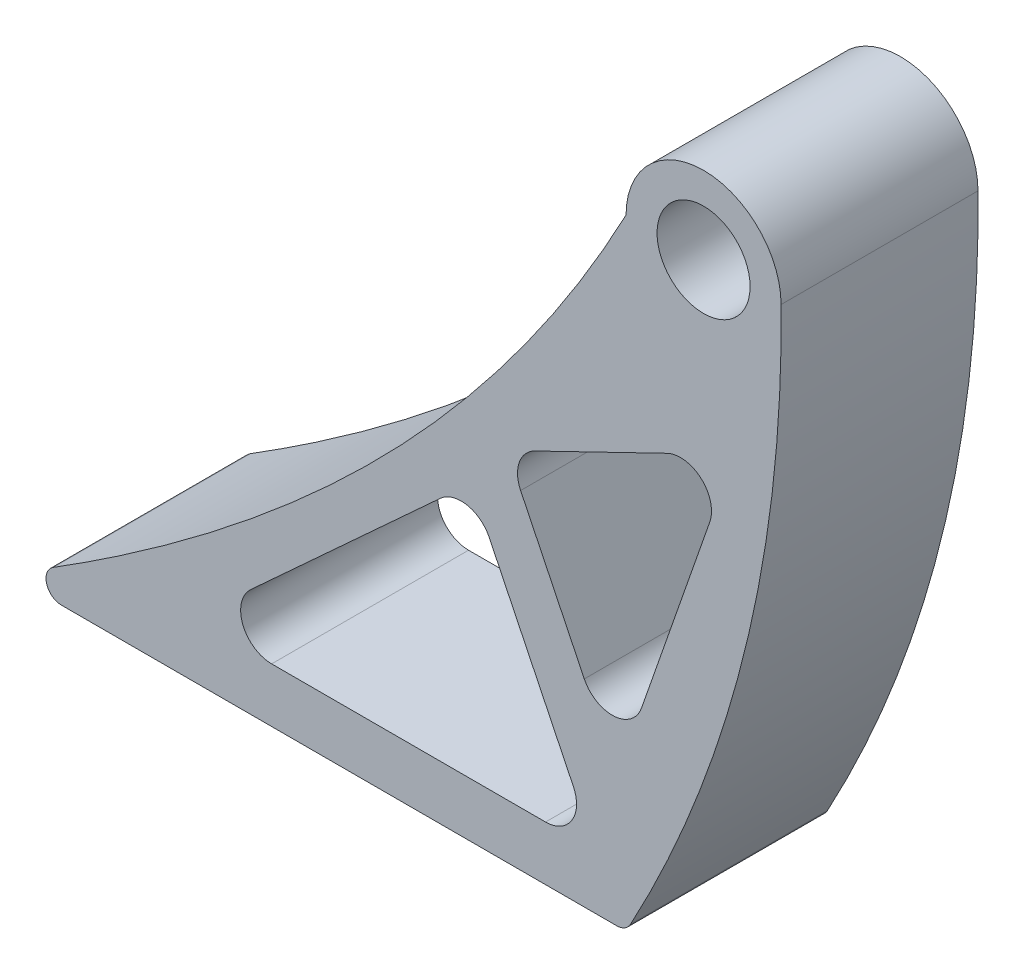
ISO-10303-21;
HEADER;
FILE_DESCRIPTION(('STEP AP214'),'2;1');
FILE_NAME('part.step','',(''),(''),'','','');
FILE_SCHEMA(('AUTOMOTIVE_DESIGN { 1 0 10303 214 1 1 1 1 }'));
ENDSEC;
DATA;
#1=APPLICATION_CONTEXT('core data for automotive mechanical design processes');
#2=APPLICATION_PROTOCOL_DEFINITION('international standard','automotive_design',2000,#1);
#3=PRODUCT_CONTEXT('',#1,'mechanical');
#4=PRODUCT('Part','Part','',(#3));
#5=PRODUCT_RELATED_PRODUCT_CATEGORY('part','',(#4));
#6=PRODUCT_DEFINITION_FORMATION('','',#4);
#7=PRODUCT_DEFINITION_CONTEXT('part definition',#1,'design');
#8=PRODUCT_DEFINITION('design','',#6,#7);
#9=PRODUCT_DEFINITION_SHAPE('','',#8);
#10=(LENGTH_UNIT() NAMED_UNIT(*) SI_UNIT(.MILLI.,.METRE.));
#11=(NAMED_UNIT(*) PLANE_ANGLE_UNIT() SI_UNIT($,.RADIAN.));
#12=(NAMED_UNIT(*) SI_UNIT($,.STERADIAN.) SOLID_ANGLE_UNIT());
#13=UNCERTAINTY_MEASURE_WITH_UNIT(LENGTH_MEASURE(1.E-05),#10,'distance_accuracy_value','');
#14=(GEOMETRIC_REPRESENTATION_CONTEXT(3) GLOBAL_UNCERTAINTY_ASSIGNED_CONTEXT((#13)) GLOBAL_UNIT_ASSIGNED_CONTEXT((#10,
#11,#12)) REPRESENTATION_CONTEXT('',''));
#15=CARTESIAN_POINT('',(0.,0.,0.));
#16=DIRECTION('',(0.,0.,1.));
#17=DIRECTION('',(1.,0.,0.));
#18=AXIS2_PLACEMENT_3D('',#15,#16,#17);
#19=CARTESIAN_POINT('',(39.4061587029717,1.,12.7));
#20=DIRECTION('',(0.,0.,1.));
#21=DIRECTION('',(1.,0.,0.));
#22=AXIS2_PLACEMENT_3D('',#19,#20,#21);
#23=PLANE('',#22);
#24=CARTESIAN_POINT('',(39.4061587029717,1.,12.7));
#25=DIRECTION('',(0.,0.,1.));
#26=DIRECTION('',(1.,0.,0.));
#27=AXIS2_PLACEMENT_3D('',#24,#25,#26);
#28=CIRCLE('',#27,1.);
#29=CARTESIAN_POINT('',(39.4061587029717,0.,12.7));
#30=VERTEX_POINT('',#29);
#31=CARTESIAN_POINT('',(40.2858714885197,0.524494568965308,12.7));
#32=VERTEX_POINT('',#31);
#33=EDGE_CURVE('E309',#30,#32,#28,.T.);
#34=ORIENTED_EDGE('',*,*,#33,.T.);
#35=CARTESIAN_POINT('',(40.2858714885197,0.524494568965308,12.7));
#36=CARTESIAN_POINT('',(46.9110134326086,12.7813936365593,12.7));
#37=CARTESIAN_POINT('',(50.1530450932038,25.9540132691208,12.7));
#38=CARTESIAN_POINT('',(50.0000000000477,40.,12.7));
#39=B_SPLINE_CURVE_WITH_KNOTS('',3,(#35,#36,#37,#38),.UNSPECIFIED.,.F.,.F.,(4,4),
(0.0140779081040227,1.),.UNSPECIFIED.);
#40=CARTESIAN_POINT('',(50.0000000000477,40.,12.7));
#41=VERTEX_POINT('',#40);
#42=EDGE_CURVE('E313',#32,#41,#39,.T.);
#43=ORIENTED_EDGE('',*,*,#42,.T.);
#44=CARTESIAN_POINT('',(45.,40.,12.7));
#45=DIRECTION('',(0.,0.,1.));
#46=DIRECTION('',(1.,0.,0.));
#47=AXIS2_PLACEMENT_3D('',#44,#45,#46);
#48=CIRCLE('',#47,5.00000000004766);
#49=CARTESIAN_POINT('',(39.9999999999523,40.,12.7));
#50=VERTEX_POINT('',#49);
#51=EDGE_CURVE('E320',#41,#50,#48,.T.);
#52=ORIENTED_EDGE('',*,*,#51,.T.);
#53=CARTESIAN_POINT('',(39.9999999999523,40.,12.7));
#54=CARTESIAN_POINT('',(31.5004996661518,23.9376744051401,12.7));
#55=CARTESIAN_POINT('',(18.6584809453997,11.5960321004043,12.7));
#56=CARTESIAN_POINT('',(3.05783486665256,1.84805765172679,12.7));
#57=B_SPLINE_CURVE_WITH_KNOTS('',3,(#53,#54,#55,#56),.UNSPECIFIED.,.F.,.F.,(4,4),
(0.0605567772307313,1.),.UNSPECIFIED.);
#58=CARTESIAN_POINT('',(3.05783486665256,1.84805765172679,12.7));
#59=VERTEX_POINT('',#58);
#60=EDGE_CURVE('E339',#50,#59,#57,.T.);
#61=ORIENTED_EDGE('',*,*,#60,.T.);
#62=CARTESIAN_POINT('',(3.58773883846976,1.,12.7));
#63=DIRECTION('',(0.,0.,1.));
#64=DIRECTION('',(-1.,0.,0.));
#65=AXIS2_PLACEMENT_3D('',#62,#63,#64);
#66=CIRCLE('',#65,1.);
#67=CARTESIAN_POINT('',(3.58773883846976,0.,12.7));
#68=VERTEX_POINT('',#67);
#69=EDGE_CURVE('E345',#59,#68,#66,.T.);
#70=ORIENTED_EDGE('',*,*,#69,.T.);
#71=DIRECTION('',(1.,0.,0.));
#72=VECTOR('',#71,1.);
#73=CARTESIAN_POINT('',(3.58773883846976,0.,12.7));
#74=LINE('',#73,#72);
#75=EDGE_CURVE('E351',#68,#30,#74,.T.);
#76=ORIENTED_EDGE('',*,*,#75,.T.);
#77=EDGE_LOOP('',(#34,#43,#52,#61,#70,#76));
#78=FACE_BOUND('',#77,.T.);
#79=CARTESIAN_POINT('',(45.,40.,12.7));
#80=DIRECTION('',(0.,0.,1.));
#81=DIRECTION('',(1.,0.,0.));
#82=AXIS2_PLACEMENT_3D('',#79,#80,#81);
#83=CIRCLE('',#82,3.);
#84=CARTESIAN_POINT('',(48.,40.,12.7));
#85=VERTEX_POINT('',#84);
#86=EDGE_CURVE('E301',#85,#85,#83,.T.);
#87=ORIENTED_EDGE('',*,*,#86,.F.);
#88=EDGE_LOOP('',(#87));
#89=FACE_BOUND('',#88,.T.);
#90=DIRECTION('',(-0.8998141071962,-0.436273506519369,0.));
#91=VECTOR('',#90,1.);
#92=CARTESIAN_POINT('',(34.1274479992558,23.8845854131092,12.7));
#93=LINE('',#92,#91);
#94=CARTESIAN_POINT('',(42.6399210906285,28.0118450937747,12.7));
#95=VERTEX_POINT('',#94);
#96=CARTESIAN_POINT('',(34.1274479992558,23.8845854131092,12.7));
#97=VERTEX_POINT('',#96);
#98=EDGE_CURVE('E241',#95,#97,#93,.T.);
#99=ORIENTED_EDGE('',*,*,#98,.F.);
#100=CARTESIAN_POINT('',(43.5124681036673,26.2122168793824,12.7));
#101=DIRECTION('',(0.,0.,1.));
#102=DIRECTION('',(-1.,0.,0.));
#103=AXIS2_PLACEMENT_3D('',#100,#101,#102);
#104=CIRCLE('',#103,2.);
#105=CARTESIAN_POINT('',(45.4003381871143,25.5519543951948,12.7));
#106=VERTEX_POINT('',#105);
#107=EDGE_CURVE('E238',#106,#95,#104,.T.);
#108=ORIENTED_EDGE('',*,*,#107,.F.);
#109=DIRECTION('',(0.330131242093745,0.943935041723551,0.));
#110=VECTOR('',#109,1.);
#111=CARTESIAN_POINT('',(45.4003381871143,25.5519543951948,12.7));
#112=LINE('',#111,#110);
#113=CARTESIAN_POINT('',(40.994560125963,12.9546362146978,12.7));
#114=VERTEX_POINT('',#113);
#115=EDGE_CURVE('E255',#114,#106,#112,.T.);
#116=ORIENTED_EDGE('',*,*,#115,.F.);
#117=CARTESIAN_POINT('',(39.1066900425159,13.6148986988852,12.7));
#118=DIRECTION('',(0.,0.,1.));
#119=DIRECTION('',(-1.,0.,0.));
#120=AXIS2_PLACEMENT_3D('',#117,#118,#119);
#121=CIRCLE('',#120,2.);
#122=CARTESIAN_POINT('',(37.3070618281234,12.7423516858465,12.7));
#123=VERTEX_POINT('',#122);
#124=EDGE_CURVE('E251',#123,#114,#121,.T.);
#125=ORIENTED_EDGE('',*,*,#124,.F.);
#126=DIRECTION('',(0.436273506519369,-0.8998141071962,0.));
#127=VECTOR('',#126,1.);
#128=CARTESIAN_POINT('',(37.3070618281234,12.7423516858465,12.7));
#129=LINE('',#128,#127);
#130=CARTESIAN_POINT('',(33.2003667979021,21.212410185678,12.7));
#131=VERTEX_POINT('',#130);
#132=EDGE_CURVE('E248',#131,#123,#129,.T.);
#133=ORIENTED_EDGE('',*,*,#132,.F.);
#134=CARTESIAN_POINT('',(34.9999950122945,22.0849571987168,12.7));
#135=DIRECTION('',(0.,0.,1.));
#136=DIRECTION('',(-1.,0.,0.));
#137=AXIS2_PLACEMENT_3D('',#134,#135,#136);
#138=CIRCLE('',#137,2.);
#139=EDGE_CURVE('E245',#97,#131,#138,.T.);
#140=ORIENTED_EDGE('',*,*,#139,.F.);
#141=EDGE_LOOP('',(#99,#108,#116,#125,#133,#140));
#142=FACE_BOUND('',#141,.T.);
#143=DIRECTION('',(-0.737154140200741,-0.675724628517346,0.));
#144=VECTOR('',#143,1.);
#145=CARTESIAN_POINT('',(15.7901544877107,6.97430828040152,12.7));
#146=LINE('',#145,#144);
#147=CARTESIAN_POINT('',(28.0204746235114,18.1854350715521,12.7));
#148=VERTEX_POINT('',#147);
#149=CARTESIAN_POINT('',(15.7901544877107,6.97430828040152,12.7));
#150=VERTEX_POINT('',#149);
#151=EDGE_CURVE('E178',#148,#150,#146,.T.);
#152=ORIENTED_EDGE('',*,*,#151,.F.);
#153=CARTESIAN_POINT('',(29.3719238805461,16.7111267911506,12.7));
#154=DIRECTION('',(0.,0.,1.));
#155=DIRECTION('',(-1.,0.,0.));
#156=AXIS2_PLACEMENT_3D('',#153,#154,#155);
#157=CIRCLE('',#156,2.);
#158=CARTESIAN_POINT('',(31.1715520949385,17.5836738041894,12.7));
#159=VERTEX_POINT('',#158);
#160=EDGE_CURVE('E169',#159,#148,#157,.T.);
#161=ORIENTED_EDGE('',*,*,#160,.F.);
#162=DIRECTION('',(-0.436273506519369,0.899814107196199,0.));
#163=VECTOR('',#162,1.);
#164=CARTESIAN_POINT('',(31.1715520949385,17.5836738041894,12.7));
#165=LINE('',#164,#163);
#166=CARTESIAN_POINT('',(36.6072499330721,6.37254701303876,12.7));
#167=VERTEX_POINT('',#166);
#168=EDGE_CURVE('E204',#167,#159,#165,.T.);
#169=ORIENTED_EDGE('',*,*,#168,.F.);
#170=CARTESIAN_POINT('',(34.8076217186797,5.5,12.7));
#171=DIRECTION('',(0.,0.,1.));
#172=DIRECTION('',(-1.,0.,0.));
#173=AXIS2_PLACEMENT_3D('',#170,#171,#172);
#174=CIRCLE('',#173,2.);
#175=CARTESIAN_POINT('',(34.8076217186797,3.5,12.7));
#176=VERTEX_POINT('',#175);
#177=EDGE_CURVE('E201',#176,#167,#174,.T.);
#178=ORIENTED_EDGE('',*,*,#177,.F.);
#179=DIRECTION('',(1.,0.,0.));
#180=VECTOR('',#179,1.);
#181=CARTESIAN_POINT('',(34.8076217186797,3.5,12.7));
#182=LINE('',#181,#180);
#183=CARTESIAN_POINT('',(17.1416037447455,3.5,12.7));
#184=VERTEX_POINT('',#183);
#185=EDGE_CURVE('E196',#184,#176,#182,.T.);
#186=ORIENTED_EDGE('',*,*,#185,.F.);
#187=CARTESIAN_POINT('',(17.1416037447454,5.5,12.7));
#188=DIRECTION('',(0.,0.,1.));
#189=DIRECTION('',(1.,0.,0.));
#190=AXIS2_PLACEMENT_3D('',#187,#188,#189);
#191=CIRCLE('',#190,2.);
#192=EDGE_CURVE('E192',#150,#184,#191,.T.);
#193=ORIENTED_EDGE('',*,*,#192,.F.);
#194=EDGE_LOOP('',(#152,#161,#169,#178,#186,#193));
#195=FACE_BOUND('',#194,.T.);
#196=ADVANCED_FACE('F43',(#78,#89,#142,#195),#23,.T.);
#197=CARTESIAN_POINT('',(39.4061587029717,1.,0.));
#198=DIRECTION('',(0.,0.,1.));
#199=DIRECTION('',(1.,0.,0.));
#200=AXIS2_PLACEMENT_3D('',#197,#198,#199);
#201=PLANE('',#200);
#202=CARTESIAN_POINT('',(43.5124681036673,26.2122168793824,0.));
#203=DIRECTION('',(0.,0.,1.));
#204=DIRECTION('',(-1.,0.,0.));
#205=AXIS2_PLACEMENT_3D('',#202,#203,#204);
#206=CIRCLE('',#205,2.);
#207=CARTESIAN_POINT('',(45.4003381871143,25.5519543951948,0.));
#208=VERTEX_POINT('',#207);
#209=CARTESIAN_POINT('',(42.6399210906285,28.0118450937747,0.));
#210=VERTEX_POINT('',#209);
#211=EDGE_CURVE('E187',#208,#210,#206,.T.);
#212=ORIENTED_EDGE('',*,*,#211,.T.);
#213=DIRECTION('',(-0.8998141071962,-0.436273506519369,0.));
#214=VECTOR('',#213,1.);
#215=CARTESIAN_POINT('',(34.1274479992558,23.8845854131092,0.));
#216=LINE('',#215,#214);
#217=CARTESIAN_POINT('',(34.1274479992558,23.8845854131092,0.));
#218=VERTEX_POINT('',#217);
#219=EDGE_CURVE('E262',#210,#218,#216,.T.);
#220=ORIENTED_EDGE('',*,*,#219,.T.);
#221=CARTESIAN_POINT('',(34.9999950122945,22.0849571987168,0.));
#222=DIRECTION('',(0.,0.,1.));
#223=DIRECTION('',(-1.,0.,0.));
#224=AXIS2_PLACEMENT_3D('',#221,#222,#223);
#225=CIRCLE('',#224,2.);
#226=CARTESIAN_POINT('',(33.2003667979021,21.212410185678,0.));
#227=VERTEX_POINT('',#226);
#228=EDGE_CURVE('E266',#218,#227,#225,.T.);
#229=ORIENTED_EDGE('',*,*,#228,.T.);
#230=DIRECTION('',(0.436273506519369,-0.8998141071962,0.));
#231=VECTOR('',#230,1.);
#232=CARTESIAN_POINT('',(37.3070618281234,12.7423516858465,0.));
#233=LINE('',#232,#231);
#234=CARTESIAN_POINT('',(37.3070618281234,12.7423516858465,0.));
#235=VERTEX_POINT('',#234);
#236=EDGE_CURVE('E270',#227,#235,#233,.T.);
#237=ORIENTED_EDGE('',*,*,#236,.T.);
#238=CARTESIAN_POINT('',(39.1066900425159,13.6148986988852,0.));
#239=DIRECTION('',(0.,0.,1.));
#240=DIRECTION('',(-1.,0.,0.));
#241=AXIS2_PLACEMENT_3D('',#238,#239,#240);
#242=CIRCLE('',#241,2.);
#243=CARTESIAN_POINT('',(40.994560125963,12.9546362146978,0.));
#244=VERTEX_POINT('',#243);
#245=EDGE_CURVE('E274',#235,#244,#242,.T.);
#246=ORIENTED_EDGE('',*,*,#245,.T.);
#247=DIRECTION('',(0.330131242093745,0.943935041723551,0.));
#248=VECTOR('',#247,1.);
#249=CARTESIAN_POINT('',(45.4003381871143,25.5519543951948,0.));
#250=LINE('',#249,#248);
#251=EDGE_CURVE('E242',#244,#208,#250,.T.);
#252=ORIENTED_EDGE('',*,*,#251,.T.);
#253=EDGE_LOOP('',(#212,#220,#229,#237,#246,#252));
#254=FACE_BOUND('',#253,.T.);
#255=CARTESIAN_POINT('',(39.4061587029717,1.,0.));
#256=DIRECTION('',(0.,0.,1.));
#257=DIRECTION('',(1.,0.,0.));
#258=AXIS2_PLACEMENT_3D('',#255,#256,#257);
#259=CIRCLE('',#258,1.);
#260=CARTESIAN_POINT('',(39.4061587029717,0.,0.));
#261=VERTEX_POINT('',#260);
#262=CARTESIAN_POINT('',(40.2858714885197,0.524494568965308,0.));
#263=VERTEX_POINT('',#262);
#264=EDGE_CURVE('E305',#261,#263,#259,.T.);
#265=ORIENTED_EDGE('',*,*,#264,.F.);
#266=DIRECTION('',(1.,0.,0.));
#267=VECTOR('',#266,1.);
#268=CARTESIAN_POINT('',(3.58773883846976,0.,0.));
#269=LINE('',#268,#267);
#270=CARTESIAN_POINT('',(3.58773883846976,0.,0.));
#271=VERTEX_POINT('',#270);
#272=EDGE_CURVE('E314',#271,#261,#269,.T.);
#273=ORIENTED_EDGE('',*,*,#272,.F.);
#274=CARTESIAN_POINT('',(3.58773883846976,1.,0.));
#275=DIRECTION('',(0.,0.,1.));
#276=DIRECTION('',(-1.,0.,0.));
#277=AXIS2_PLACEMENT_3D('',#274,#275,#276);
#278=CIRCLE('',#277,1.);
#279=CARTESIAN_POINT('',(3.05783486665256,1.84805765172679,0.));
#280=VERTEX_POINT('',#279);
#281=EDGE_CURVE('E374',#280,#271,#278,.T.);
#282=ORIENTED_EDGE('',*,*,#281,.F.);
#283=CARTESIAN_POINT('',(39.9999999999523,40.,0.));
#284=CARTESIAN_POINT('',(31.5004996661518,23.9376744051401,0.));
#285=CARTESIAN_POINT('',(18.6584809453997,11.5960321004043,0.));
#286=CARTESIAN_POINT('',(3.05783486665256,1.84805765172679,0.));
#287=B_SPLINE_CURVE_WITH_KNOTS('',3,(#283,#284,#285,#286),.UNSPECIFIED.,.F.,.F.,(4,4),
(0.0605567772307313,1.),.UNSPECIFIED.);
#288=CARTESIAN_POINT('',(39.9999999999523,40.,0.));
#289=VERTEX_POINT('',#288);
#290=EDGE_CURVE('E369',#289,#280,#287,.T.);
#291=ORIENTED_EDGE('',*,*,#290,.F.);
#292=CARTESIAN_POINT('',(45.,40.,0.));
#293=DIRECTION('',(0.,0.,1.));
#294=DIRECTION('',(1.,0.,0.));
#295=AXIS2_PLACEMENT_3D('',#292,#293,#294);
#296=CIRCLE('',#295,5.00000000004766);
#297=CARTESIAN_POINT('',(50.0000000000477,40.,0.));
#298=VERTEX_POINT('',#297);
#299=EDGE_CURVE('E363',#298,#289,#296,.T.);
#300=ORIENTED_EDGE('',*,*,#299,.F.);
#301=CARTESIAN_POINT('',(40.2858714885197,0.524494568965308,0.));
#302=CARTESIAN_POINT('',(46.9110134326086,12.7813936365593,0.));
#303=CARTESIAN_POINT('',(50.1530450932038,25.9540132691208,0.));
#304=CARTESIAN_POINT('',(50.0000000000477,40.,0.));
#305=B_SPLINE_CURVE_WITH_KNOTS('',3,(#301,#302,#303,#304),.UNSPECIFIED.,.F.,.F.,(4,4),
(0.0140779081040227,1.),.UNSPECIFIED.);
#306=EDGE_CURVE('E358',#263,#298,#305,.T.);
#307=ORIENTED_EDGE('',*,*,#306,.F.);
#308=EDGE_LOOP('',(#265,#273,#282,#291,#300,#307));
#309=FACE_BOUND('',#308,.T.);
#310=CARTESIAN_POINT('',(45.,40.,0.));
#311=DIRECTION('',(0.,0.,1.));
#312=DIRECTION('',(1.,0.,0.));
#313=AXIS2_PLACEMENT_3D('',#310,#311,#312);
#314=CIRCLE('',#313,3.);
#315=CARTESIAN_POINT('',(48.,40.,0.));
#316=VERTEX_POINT('',#315);
#317=EDGE_CURVE('E300',#316,#316,#314,.T.);
#318=ORIENTED_EDGE('',*,*,#317,.T.);
#319=EDGE_LOOP('',(#318));
#320=FACE_BOUND('',#319,.T.);
#321=CARTESIAN_POINT('',(29.3719238805461,16.7111267911506,0.));
#322=DIRECTION('',(0.,0.,1.));
#323=DIRECTION('',(-1.,0.,0.));
#324=AXIS2_PLACEMENT_3D('',#321,#322,#323);
#325=CIRCLE('',#324,2.);
#326=CARTESIAN_POINT('',(31.1715520949385,17.5836738041894,0.));
#327=VERTEX_POINT('',#326);
#328=CARTESIAN_POINT('',(28.0204746235114,18.1854350715521,0.));
#329=VERTEX_POINT('',#328);
#330=EDGE_CURVE('E67',#327,#329,#325,.T.);
#331=ORIENTED_EDGE('',*,*,#330,.T.);
#332=DIRECTION('',(-0.737154140200741,-0.675724628517346,0.));
#333=VECTOR('',#332,1.);
#334=CARTESIAN_POINT('',(15.7901544877107,6.97430828040152,0.));
#335=LINE('',#334,#333);
#336=CARTESIAN_POINT('',(15.7901544877107,6.97430828040152,0.));
#337=VERTEX_POINT('',#336);
#338=EDGE_CURVE('E185',#329,#337,#335,.T.);
#339=ORIENTED_EDGE('',*,*,#338,.T.);
#340=CARTESIAN_POINT('',(17.1416037447454,5.5,0.));
#341=DIRECTION('',(0.,0.,1.));
#342=DIRECTION('',(1.,0.,0.));
#343=AXIS2_PLACEMENT_3D('',#340,#341,#342);
#344=CIRCLE('',#343,2.);
#345=CARTESIAN_POINT('',(17.1416037447455,3.5,0.));
#346=VERTEX_POINT('',#345);
#347=EDGE_CURVE('E211',#337,#346,#344,.T.);
#348=ORIENTED_EDGE('',*,*,#347,.T.);
#349=DIRECTION('',(1.,0.,0.));
#350=VECTOR('',#349,1.);
#351=CARTESIAN_POINT('',(34.8076217186797,3.5,0.));
#352=LINE('',#351,#350);
#353=CARTESIAN_POINT('',(34.8076217186797,3.5,0.));
#354=VERTEX_POINT('',#353);
#355=EDGE_CURVE('E215',#346,#354,#352,.T.);
#356=ORIENTED_EDGE('',*,*,#355,.T.);
#357=CARTESIAN_POINT('',(34.8076217186797,5.5,0.));
#358=DIRECTION('',(0.,0.,1.));
#359=DIRECTION('',(-1.,0.,0.));
#360=AXIS2_PLACEMENT_3D('',#357,#358,#359);
#361=CIRCLE('',#360,2.);
#362=CARTESIAN_POINT('',(36.6072499330721,6.37254701303876,0.));
#363=VERTEX_POINT('',#362);
#364=EDGE_CURVE('E219',#354,#363,#361,.T.);
#365=ORIENTED_EDGE('',*,*,#364,.T.);
#366=DIRECTION('',(-0.436273506519369,0.899814107196199,0.));
#367=VECTOR('',#366,1.);
#368=CARTESIAN_POINT('',(31.1715520949385,17.5836738041894,0.));
#369=LINE('',#368,#367);
#370=EDGE_CURVE('E179',#363,#327,#369,.T.);
#371=ORIENTED_EDGE('',*,*,#370,.T.);
#372=EDGE_LOOP('',(#331,#339,#348,#356,#365,#371));
#373=FACE_BOUND('',#372,.T.);
#374=ADVANCED_FACE('F405',(#254,#309,#320,#373),#201,.F.);
#375=CARTESIAN_POINT('',(39.4061587029717,1.,12.7));
#376=DIRECTION('',(0.,0.,-1.));
#377=DIRECTION('',(-1.,0.,0.));
#378=AXIS2_PLACEMENT_3D('',#375,#376,#377);
#379=CYLINDRICAL_SURFACE('',#378,1.);
#380=ORIENTED_EDGE('',*,*,#264,.T.);
#381=DIRECTION('',(0.,0.,-1.));
#382=VECTOR('',#381,1.);
#383=CARTESIAN_POINT('',(40.2858714885197,0.524494568965308,12.7));
#384=LINE('',#383,#382);
#385=EDGE_CURVE('E11',#32,#263,#384,.T.);
#386=ORIENTED_EDGE('',*,*,#385,.F.);
#387=ORIENTED_EDGE('',*,*,#33,.F.);
#388=DIRECTION('',(0.,0.,-1.));
#389=VECTOR('',#388,1.);
#390=CARTESIAN_POINT('',(39.4061587029717,0.,12.7));
#391=LINE('',#390,#389);
#392=EDGE_CURVE('E354',#30,#261,#391,.T.);
#393=ORIENTED_EDGE('',*,*,#392,.T.);
#394=EDGE_LOOP('',(#380,#386,#387,#393));
#395=FACE_BOUND('',#394,.T.);
#396=ADVANCED_FACE('F45',(#395),#379,.T.);
#397=DIRECTION('',(0.,0.,-1.));
#398=VECTOR('',#397,1.);
#399=SURFACE_OF_LINEAR_EXTRUSION('',#39,#398);
#400=ORIENTED_EDGE('',*,*,#306,.T.);
#401=DIRECTION('',(0.,0.,-1.));
#402=VECTOR('',#401,1.);
#403=CARTESIAN_POINT('',(50.0000000000477,40.,12.7));
#404=LINE('',#403,#402);
#405=EDGE_CURVE('E52',#41,#298,#404,.T.);
#406=ORIENTED_EDGE('',*,*,#405,.F.);
#407=ORIENTED_EDGE('',*,*,#42,.F.);
#408=ORIENTED_EDGE('',*,*,#385,.T.);
#409=EDGE_LOOP('',(#400,#406,#407,#408));
#410=FACE_BOUND('',#409,.T.);
#411=ADVANCED_FACE('F325',(#410),#399,.F.);
#412=CARTESIAN_POINT('',(45.,40.,12.7));
#413=DIRECTION('',(0.,0.,-1.));
#414=DIRECTION('',(-1.,0.,0.));
#415=AXIS2_PLACEMENT_3D('',#412,#413,#414);
#416=CYLINDRICAL_SURFACE('',#415,5.00000000004766);
#417=ORIENTED_EDGE('',*,*,#299,.T.);
#418=DIRECTION('',(0.,0.,-1.));
#419=VECTOR('',#418,1.);
#420=CARTESIAN_POINT('',(39.9999999999523,40.,12.7));
#421=LINE('',#420,#419);
#422=EDGE_CURVE('E393',#50,#289,#421,.T.);
#423=ORIENTED_EDGE('',*,*,#422,.F.);
#424=ORIENTED_EDGE('',*,*,#51,.F.);
#425=ORIENTED_EDGE('',*,*,#405,.T.);
#426=EDGE_LOOP('',(#417,#423,#424,#425));
#427=FACE_BOUND('',#426,.T.);
#428=ADVANCED_FACE('F328',(#427),#416,.T.);
#429=DIRECTION('',(0.,0.,-1.));
#430=VECTOR('',#429,1.);
#431=SURFACE_OF_LINEAR_EXTRUSION('',#57,#430);
#432=ORIENTED_EDGE('',*,*,#290,.T.);
#433=DIRECTION('',(0.,0.,-1.));
#434=VECTOR('',#433,1.);
#435=CARTESIAN_POINT('',(3.05783486665256,1.84805765172679,12.7));
#436=LINE('',#435,#434);
#437=EDGE_CURVE('E389',#59,#280,#436,.T.);
#438=ORIENTED_EDGE('',*,*,#437,.F.);
#439=ORIENTED_EDGE('',*,*,#60,.F.);
#440=ORIENTED_EDGE('',*,*,#422,.T.);
#441=EDGE_LOOP('',(#432,#438,#439,#440));
#442=FACE_BOUND('',#441,.T.);
#443=ADVANCED_FACE('F332',(#442),#431,.F.);
#444=CARTESIAN_POINT('',(3.58773883846976,1.,12.7));
#445=DIRECTION('',(0.,0.,-1.));
#446=DIRECTION('',(-1.,0.,0.));
#447=AXIS2_PLACEMENT_3D('',#444,#445,#446);
#448=CYLINDRICAL_SURFACE('',#447,1.);
#449=ORIENTED_EDGE('',*,*,#281,.T.);
#450=DIRECTION('',(0.,0.,-1.));
#451=VECTOR('',#450,1.);
#452=CARTESIAN_POINT('',(3.58773883846976,0.,12.7));
#453=LINE('',#452,#451);
#454=EDGE_CURVE('E385',#68,#271,#453,.T.);
#455=ORIENTED_EDGE('',*,*,#454,.F.);
#456=ORIENTED_EDGE('',*,*,#69,.F.);
#457=ORIENTED_EDGE('',*,*,#437,.T.);
#458=EDGE_LOOP('',(#449,#455,#456,#457));
#459=FACE_BOUND('',#458,.T.);
#460=ADVANCED_FACE('F336',(#459),#448,.T.);
#461=CARTESIAN_POINT('',(3.58773883846976,0.,12.7));
#462=DIRECTION('',(0.,1.,0.));
#463=DIRECTION('',(0.,0.,1.));
#464=AXIS2_PLACEMENT_3D('',#461,#462,#463);
#465=PLANE('',#464);
#466=ORIENTED_EDGE('',*,*,#272,.T.);
#467=ORIENTED_EDGE('',*,*,#392,.F.);
#468=ORIENTED_EDGE('',*,*,#75,.F.);
#469=ORIENTED_EDGE('',*,*,#454,.T.);
#470=EDGE_LOOP('',(#466,#467,#468,#469));
#471=FACE_BOUND('',#470,.T.);
#472=ADVANCED_FACE('F423',(#471),#465,.F.);
#473=CARTESIAN_POINT('',(45.,40.,12.7));
#474=DIRECTION('',(0.,0.,-1.));
#475=DIRECTION('',(-1.,0.,0.));
#476=AXIS2_PLACEMENT_3D('',#473,#474,#475);
#477=CYLINDRICAL_SURFACE('',#476,3.);
#478=ORIENTED_EDGE('',*,*,#86,.T.);
#479=EDGE_LOOP('',(#478));
#480=FACE_BOUND('',#479,.T.);
#481=ORIENTED_EDGE('',*,*,#317,.F.);
#482=EDGE_LOOP('',(#481));
#483=FACE_BOUND('',#482,.T.);
#484=ADVANCED_FACE('F425',(#480,#483),#477,.F.);
#485=CARTESIAN_POINT('',(43.5124681036673,26.2122168793824,12.7));
#486=DIRECTION('',(0.,0.,-1.));
#487=DIRECTION('',(-1.,0.,0.));
#488=AXIS2_PLACEMENT_3D('',#485,#486,#487);
#489=CYLINDRICAL_SURFACE('',#488,2.);
#490=ORIENTED_EDGE('',*,*,#211,.F.);
#491=DIRECTION('',(0.,0.,-1.));
#492=VECTOR('',#491,1.);
#493=CARTESIAN_POINT('',(45.4003381871143,25.5519543951948,12.7));
#494=LINE('',#493,#492);
#495=EDGE_CURVE('E258',#106,#208,#494,.T.);
#496=ORIENTED_EDGE('',*,*,#495,.F.);
#497=ORIENTED_EDGE('',*,*,#107,.T.);
#498=DIRECTION('',(0.,0.,-1.));
#499=VECTOR('',#498,1.);
#500=CARTESIAN_POINT('',(42.6399210906285,28.0118450937747,12.7));
#501=LINE('',#500,#499);
#502=EDGE_CURVE('E296',#95,#210,#501,.T.);
#503=ORIENTED_EDGE('',*,*,#502,.T.);
#504=EDGE_LOOP('',(#490,#496,#497,#503));
#505=FACE_BOUND('',#504,.T.);
#506=ADVANCED_FACE('F430',(#505),#489,.F.);
#507=CARTESIAN_POINT('',(34.1274479992558,23.8845854131092,12.7));
#508=DIRECTION('',(0.436273506519369,-0.8998141071962,0.));
#509=DIRECTION('',(0.8998141071962,0.436273506519369,0.));
#510=AXIS2_PLACEMENT_3D('',#507,#508,#509);
#511=PLANE('',#510);
#512=ORIENTED_EDGE('',*,*,#219,.F.);
#513=ORIENTED_EDGE('',*,*,#502,.F.);
#514=ORIENTED_EDGE('',*,*,#98,.T.);
#515=DIRECTION('',(0.,0.,-1.));
#516=VECTOR('',#515,1.);
#517=CARTESIAN_POINT('',(34.1274479992558,23.8845854131092,12.7));
#518=LINE('',#517,#516);
#519=EDGE_CURVE('E293',#97,#218,#518,.T.);
#520=ORIENTED_EDGE('',*,*,#519,.T.);
#521=EDGE_LOOP('',(#512,#513,#514,#520));
#522=FACE_BOUND('',#521,.T.);
#523=ADVANCED_FACE('F443',(#522),#511,.T.);
#524=CARTESIAN_POINT('',(34.9999950122945,22.0849571987168,12.7));
#525=DIRECTION('',(0.,0.,-1.));
#526=DIRECTION('',(-1.,0.,0.));
#527=AXIS2_PLACEMENT_3D('',#524,#525,#526);
#528=CYLINDRICAL_SURFACE('',#527,2.);
#529=ORIENTED_EDGE('',*,*,#228,.F.);
#530=ORIENTED_EDGE('',*,*,#519,.F.);
#531=ORIENTED_EDGE('',*,*,#139,.T.);
#532=DIRECTION('',(0.,0.,-1.));
#533=VECTOR('',#532,1.);
#534=CARTESIAN_POINT('',(33.2003667979021,21.212410185678,12.7));
#535=LINE('',#534,#533);
#536=EDGE_CURVE('E290',#131,#227,#535,.T.);
#537=ORIENTED_EDGE('',*,*,#536,.T.);
#538=EDGE_LOOP('',(#529,#530,#531,#537));
#539=FACE_BOUND('',#538,.T.);
#540=ADVANCED_FACE('F447',(#539),#528,.F.);
#541=CARTESIAN_POINT('',(37.3070618281234,12.7423516858465,12.7));
#542=DIRECTION('',(0.8998141071962,0.436273506519369,0.));
#543=DIRECTION('',(-0.436273506519369,0.8998141071962,0.));
#544=AXIS2_PLACEMENT_3D('',#541,#542,#543);
#545=PLANE('',#544);
#546=ORIENTED_EDGE('',*,*,#236,.F.);
#547=ORIENTED_EDGE('',*,*,#536,.F.);
#548=ORIENTED_EDGE('',*,*,#132,.T.);
#549=DIRECTION('',(0.,0.,-1.));
#550=VECTOR('',#549,1.);
#551=CARTESIAN_POINT('',(37.3070618281234,12.7423516858465,12.7));
#552=LINE('',#551,#550);
#553=EDGE_CURVE('E287',#123,#235,#552,.T.);
#554=ORIENTED_EDGE('',*,*,#553,.T.);
#555=EDGE_LOOP('',(#546,#547,#548,#554));
#556=FACE_BOUND('',#555,.T.);
#557=ADVANCED_FACE('F451',(#556),#545,.T.);
#558=CARTESIAN_POINT('',(39.1066900425159,13.6148986988852,12.7));
#559=DIRECTION('',(0.,0.,-1.));
#560=DIRECTION('',(-1.,0.,0.));
#561=AXIS2_PLACEMENT_3D('',#558,#559,#560);
#562=CYLINDRICAL_SURFACE('',#561,2.);
#563=ORIENTED_EDGE('',*,*,#245,.F.);
#564=ORIENTED_EDGE('',*,*,#553,.F.);
#565=ORIENTED_EDGE('',*,*,#124,.T.);
#566=DIRECTION('',(0.,0.,-1.));
#567=VECTOR('',#566,1.);
#568=CARTESIAN_POINT('',(40.994560125963,12.9546362146978,12.7));
#569=LINE('',#568,#567);
#570=EDGE_CURVE('E284',#114,#244,#569,.T.);
#571=ORIENTED_EDGE('',*,*,#570,.T.);
#572=EDGE_LOOP('',(#563,#564,#565,#571));
#573=FACE_BOUND('',#572,.T.);
#574=ADVANCED_FACE('F455',(#573),#562,.F.);
#575=CARTESIAN_POINT('',(45.4003381871143,25.5519543951948,12.7));
#576=DIRECTION('',(-0.943935041723551,0.330131242093745,0.));
#577=DIRECTION('',(-0.330131242093745,-0.943935041723551,0.));
#578=AXIS2_PLACEMENT_3D('',#575,#576,#577);
#579=PLANE('',#578);
#580=ORIENTED_EDGE('',*,*,#251,.F.);
#581=ORIENTED_EDGE('',*,*,#570,.F.);
#582=ORIENTED_EDGE('',*,*,#115,.T.);
#583=ORIENTED_EDGE('',*,*,#495,.T.);
#584=EDGE_LOOP('',(#580,#581,#582,#583));
#585=FACE_BOUND('',#584,.T.);
#586=ADVANCED_FACE('F459',(#585),#579,.T.);
#587=CARTESIAN_POINT('',(29.3719238805461,16.7111267911506,12.7));
#588=DIRECTION('',(0.,0.,-1.));
#589=DIRECTION('',(-1.,0.,0.));
#590=AXIS2_PLACEMENT_3D('',#587,#588,#589);
#591=CYLINDRICAL_SURFACE('',#590,2.);
#592=ORIENTED_EDGE('',*,*,#330,.F.);
#593=DIRECTION('',(0.,0.,-1.));
#594=VECTOR('',#593,1.);
#595=CARTESIAN_POINT('',(31.1715520949385,17.5836738041894,12.7));
#596=LINE('',#595,#594);
#597=EDGE_CURVE('E173',#159,#327,#596,.T.);
#598=ORIENTED_EDGE('',*,*,#597,.F.);
#599=ORIENTED_EDGE('',*,*,#160,.T.);
#600=DIRECTION('',(0.,0.,-1.));
#601=VECTOR('',#600,1.);
#602=CARTESIAN_POINT('',(28.0204746235114,18.1854350715521,12.7));
#603=LINE('',#602,#601);
#604=EDGE_CURVE('E172',#148,#329,#603,.T.);
#605=ORIENTED_EDGE('',*,*,#604,.T.);
#606=EDGE_LOOP('',(#592,#598,#599,#605));
#607=FACE_BOUND('',#606,.T.);
#608=ADVANCED_FACE('F171',(#607),#591,.F.);
#609=CARTESIAN_POINT('',(15.7901544877107,6.97430828040152,12.7));
#610=DIRECTION('',(0.675724628517346,-0.737154140200741,0.));
#611=DIRECTION('',(0.737154140200741,0.675724628517346,0.));
#612=AXIS2_PLACEMENT_3D('',#609,#610,#611);
#613=PLANE('',#612);
#614=ORIENTED_EDGE('',*,*,#338,.F.);
#615=ORIENTED_EDGE('',*,*,#604,.F.);
#616=ORIENTED_EDGE('',*,*,#151,.T.);
#617=DIRECTION('',(0.,0.,-1.));
#618=VECTOR('',#617,1.);
#619=CARTESIAN_POINT('',(15.7901544877107,6.97430828040152,12.7));
#620=LINE('',#619,#618);
#621=EDGE_CURVE('E188',#150,#337,#620,.T.);
#622=ORIENTED_EDGE('',*,*,#621,.T.);
#623=EDGE_LOOP('',(#614,#615,#616,#622));
#624=FACE_BOUND('',#623,.T.);
#625=ADVANCED_FACE('F182',(#624),#613,.T.);
#626=CARTESIAN_POINT('',(17.1416037447454,5.5,12.7));
#627=DIRECTION('',(0.,0.,-1.));
#628=DIRECTION('',(-1.,0.,0.));
#629=AXIS2_PLACEMENT_3D('',#626,#627,#628);
#630=CYLINDRICAL_SURFACE('',#629,2.);
#631=ORIENTED_EDGE('',*,*,#347,.F.);
#632=ORIENTED_EDGE('',*,*,#621,.F.);
#633=ORIENTED_EDGE('',*,*,#192,.T.);
#634=DIRECTION('',(0.,0.,-1.));
#635=VECTOR('',#634,1.);
#636=CARTESIAN_POINT('',(17.1416037447455,3.5,12.7));
#637=LINE('',#636,#635);
#638=EDGE_CURVE('E233',#184,#346,#637,.T.);
#639=ORIENTED_EDGE('',*,*,#638,.T.);
#640=EDGE_LOOP('',(#631,#632,#633,#639));
#641=FACE_BOUND('',#640,.T.);
#642=ADVANCED_FACE('F468',(#641),#630,.F.);
#643=CARTESIAN_POINT('',(34.8076217186797,3.5,12.7));
#644=DIRECTION('',(0.,1.,0.));
#645=DIRECTION('',(0.,0.,1.));
#646=AXIS2_PLACEMENT_3D('',#643,#644,#645);
#647=PLANE('',#646);
#648=ORIENTED_EDGE('',*,*,#355,.F.);
#649=ORIENTED_EDGE('',*,*,#638,.F.);
#650=ORIENTED_EDGE('',*,*,#185,.T.);
#651=DIRECTION('',(0.,0.,-1.));
#652=VECTOR('',#651,1.);
#653=CARTESIAN_POINT('',(34.8076217186797,3.5,12.7));
#654=LINE('',#653,#652);
#655=EDGE_CURVE('E230',#176,#354,#654,.T.);
#656=ORIENTED_EDGE('',*,*,#655,.T.);
#657=EDGE_LOOP('',(#648,#649,#650,#656));
#658=FACE_BOUND('',#657,.T.);
#659=ADVANCED_FACE('F471',(#658),#647,.T.);
#660=CARTESIAN_POINT('',(34.8076217186797,5.5,12.7));
#661=DIRECTION('',(0.,0.,-1.));
#662=DIRECTION('',(-1.,0.,0.));
#663=AXIS2_PLACEMENT_3D('',#660,#661,#662);
#664=CYLINDRICAL_SURFACE('',#663,2.);
#665=ORIENTED_EDGE('',*,*,#364,.F.);
#666=ORIENTED_EDGE('',*,*,#655,.F.);
#667=ORIENTED_EDGE('',*,*,#177,.T.);
#668=DIRECTION('',(0.,0.,-1.));
#669=VECTOR('',#668,1.);
#670=CARTESIAN_POINT('',(36.6072499330721,6.37254701303876,12.7));
#671=LINE('',#670,#669);
#672=EDGE_CURVE('E59',#167,#363,#671,.T.);
#673=ORIENTED_EDGE('',*,*,#672,.T.);
#674=EDGE_LOOP('',(#665,#666,#667,#673));
#675=FACE_BOUND('',#674,.T.);
#676=ADVANCED_FACE('F475',(#675),#664,.F.);
#677=CARTESIAN_POINT('',(31.1715520949385,17.5836738041894,12.7));
#678=DIRECTION('',(-0.8998141071962,-0.436273506519369,0.));
#679=DIRECTION('',(0.436273506519369,-0.8998141071962,0.));
#680=AXIS2_PLACEMENT_3D('',#677,#678,#679);
#681=PLANE('',#680);
#682=ORIENTED_EDGE('',*,*,#370,.F.);
#683=ORIENTED_EDGE('',*,*,#672,.F.);
#684=ORIENTED_EDGE('',*,*,#168,.T.);
#685=ORIENTED_EDGE('',*,*,#597,.T.);
#686=EDGE_LOOP('',(#682,#683,#684,#685));
#687=FACE_BOUND('',#686,.T.);
#688=ADVANCED_FACE('F479',(#687),#681,.T.);
#689=CLOSED_SHELL('',(#196,#374,#396,#411,#428,#443,#460,#472,#484,#506,#523,#540,#557,#574,
#586,#608,#625,#642,#659,#676,#688));
#690=MANIFOLD_SOLID_BREP('B2',#689);
#691=ADVANCED_BREP_SHAPE_REPRESENTATION('',(#18,#690),#14);
#692=SHAPE_DEFINITION_REPRESENTATION(#9,#691);
ENDSEC;
END-ISO-10303-21;
